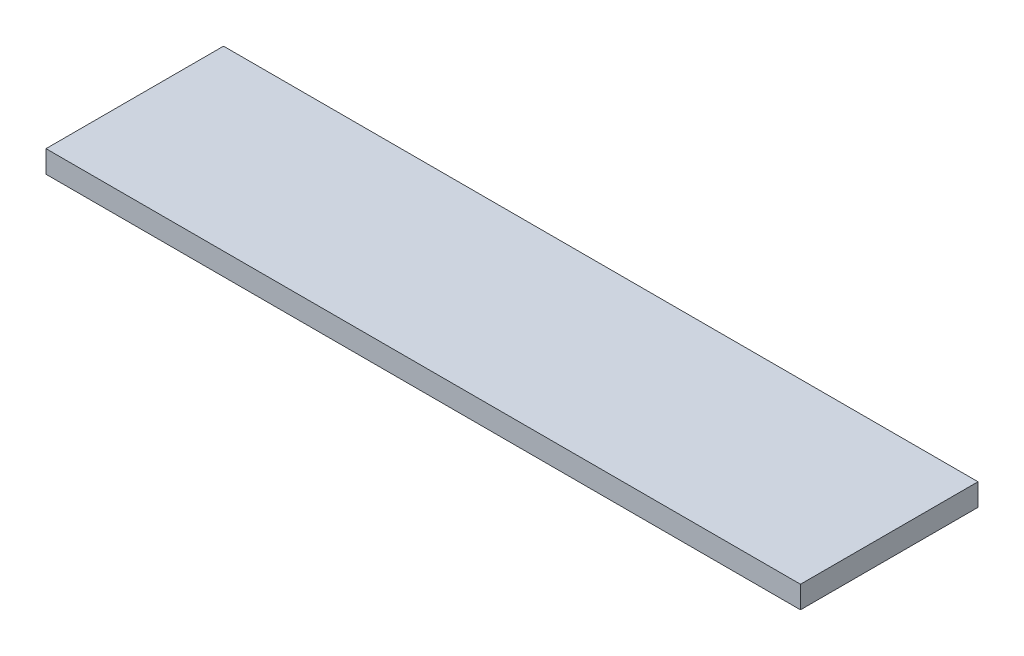
ISO-10303-21;
HEADER;
FILE_DESCRIPTION(('STEP AP214'),'2;1');
FILE_NAME('part.step','',(''),(''),'','','');
FILE_SCHEMA(('AUTOMOTIVE_DESIGN { 1 0 10303 214 1 1 1 1 }'));
ENDSEC;
DATA;
#1=APPLICATION_CONTEXT('core data for automotive mechanical design processes');
#2=APPLICATION_PROTOCOL_DEFINITION('international standard','automotive_design',2000,#1);
#3=PRODUCT_CONTEXT('',#1,'mechanical');
#4=PRODUCT('Part','Part','',(#3));
#5=PRODUCT_RELATED_PRODUCT_CATEGORY('part','',(#4));
#6=PRODUCT_DEFINITION_FORMATION('','',#4);
#7=PRODUCT_DEFINITION_CONTEXT('part definition',#1,'design');
#8=PRODUCT_DEFINITION('design','',#6,#7);
#9=PRODUCT_DEFINITION_SHAPE('','',#8);
#10=(LENGTH_UNIT() NAMED_UNIT(*) SI_UNIT(.MILLI.,.METRE.));
#11=(NAMED_UNIT(*) PLANE_ANGLE_UNIT() SI_UNIT($,.RADIAN.));
#12=(NAMED_UNIT(*) SI_UNIT($,.STERADIAN.) SOLID_ANGLE_UNIT());
#13=UNCERTAINTY_MEASURE_WITH_UNIT(LENGTH_MEASURE(1.E-05),#10,'distance_accuracy_value','');
#14=(GEOMETRIC_REPRESENTATION_CONTEXT(3) GLOBAL_UNCERTAINTY_ASSIGNED_CONTEXT((#13)) GLOBAL_UNIT_ASSIGNED_CONTEXT((#10,
#11,#12)) REPRESENTATION_CONTEXT('',''));
#15=CARTESIAN_POINT('',(0.,0.,0.));
#16=DIRECTION('',(0.,0.,1.));
#17=DIRECTION('',(1.,0.,0.));
#18=AXIS2_PLACEMENT_3D('',#15,#16,#17);
#19=CARTESIAN_POINT('',(85.,5.,-20.));
#20=DIRECTION('',(-1.,0.,0.));
#21=DIRECTION('',(0.,0.,1.));
#22=AXIS2_PLACEMENT_3D('',#19,#20,#21);
#23=PLANE('',#22);
#24=DIRECTION('',(0.,0.,-1.));
#25=VECTOR('',#24,1.);
#26=CARTESIAN_POINT('',(85.,0.,-20.));
#27=LINE('',#26,#25);
#28=CARTESIAN_POINT('',(85.,0.,20.));
#29=VERTEX_POINT('',#28);
#30=CARTESIAN_POINT('',(85.,0.,-20.));
#31=VERTEX_POINT('',#30);
#32=EDGE_CURVE('E103',#29,#31,#27,.T.);
#33=ORIENTED_EDGE('',*,*,#32,.T.);
#34=DIRECTION('',(0.,-1.,0.));
#35=VECTOR('',#34,1.);
#36=CARTESIAN_POINT('',(85.,5.,-20.));
#37=LINE('',#36,#35);
#38=CARTESIAN_POINT('',(85.,5.,-20.));
#39=VERTEX_POINT('',#38);
#40=EDGE_CURVE('E11',#39,#31,#37,.T.);
#41=ORIENTED_EDGE('',*,*,#40,.F.);
#42=DIRECTION('',(0.,0.,-1.));
#43=VECTOR('',#42,1.);
#44=CARTESIAN_POINT('',(85.,5.,-20.));
#45=LINE('',#44,#43);
#46=CARTESIAN_POINT('',(85.,5.,20.));
#47=VERTEX_POINT('',#46);
#48=EDGE_CURVE('E91',#47,#39,#45,.T.);
#49=ORIENTED_EDGE('',*,*,#48,.F.);
#50=DIRECTION('',(0.,-1.,0.));
#51=VECTOR('',#50,1.);
#52=CARTESIAN_POINT('',(85.,5.,20.));
#53=LINE('',#52,#51);
#54=EDGE_CURVE('E99',#47,#29,#53,.T.);
#55=ORIENTED_EDGE('',*,*,#54,.T.);
#56=EDGE_LOOP('',(#33,#41,#49,#55));
#57=FACE_BOUND('',#56,.T.);
#58=ADVANCED_FACE('F40',(#57),#23,.F.);
#59=CARTESIAN_POINT('',(-85.,5.,-20.));
#60=DIRECTION('',(0.,0.,1.));
#61=DIRECTION('',(1.,0.,0.));
#62=AXIS2_PLACEMENT_3D('',#59,#60,#61);
#63=PLANE('',#62);
#64=DIRECTION('',(-1.,0.,0.));
#65=VECTOR('',#64,1.);
#66=CARTESIAN_POINT('',(-85.,0.,-20.));
#67=LINE('',#66,#65);
#68=CARTESIAN_POINT('',(-85.,0.,-20.));
#69=VERTEX_POINT('',#68);
#70=EDGE_CURVE('E95',#31,#69,#67,.T.);
#71=ORIENTED_EDGE('',*,*,#70,.T.);
#72=DIRECTION('',(0.,-1.,0.));
#73=VECTOR('',#72,1.);
#74=CARTESIAN_POINT('',(-85.,5.,-20.));
#75=LINE('',#74,#73);
#76=CARTESIAN_POINT('',(-85.,5.,-20.));
#77=VERTEX_POINT('',#76);
#78=EDGE_CURVE('E48',#77,#69,#75,.T.);
#79=ORIENTED_EDGE('',*,*,#78,.F.);
#80=DIRECTION('',(-1.,0.,0.));
#81=VECTOR('',#80,1.);
#82=CARTESIAN_POINT('',(-85.,5.,-20.));
#83=LINE('',#82,#81);
#84=EDGE_CURVE('E86',#39,#77,#83,.T.);
#85=ORIENTED_EDGE('',*,*,#84,.F.);
#86=ORIENTED_EDGE('',*,*,#40,.T.);
#87=EDGE_LOOP('',(#71,#79,#85,#86));
#88=FACE_BOUND('',#87,.T.);
#89=ADVANCED_FACE('F94',(#88),#63,.F.);
#90=CARTESIAN_POINT('',(-85.,5.,-20.));
#91=DIRECTION('',(1.,0.,0.));
#92=DIRECTION('',(0.,0.,-1.));
#93=AXIS2_PLACEMENT_3D('',#90,#91,#92);
#94=PLANE('',#93);
#95=DIRECTION('',(0.,0.,1.));
#96=VECTOR('',#95,1.);
#97=CARTESIAN_POINT('',(-85.,0.,-20.));
#98=LINE('',#97,#96);
#99=CARTESIAN_POINT('',(-85.,0.,20.));
#100=VERTEX_POINT('',#99);
#101=EDGE_CURVE('E73',#69,#100,#98,.T.);
#102=ORIENTED_EDGE('',*,*,#101,.T.);
#103=DIRECTION('',(0.,-1.,0.));
#104=VECTOR('',#103,1.);
#105=CARTESIAN_POINT('',(-85.,5.,20.));
#106=LINE('',#105,#104);
#107=CARTESIAN_POINT('',(-85.,5.,20.));
#108=VERTEX_POINT('',#107);
#109=EDGE_CURVE('E96',#108,#100,#106,.T.);
#110=ORIENTED_EDGE('',*,*,#109,.F.);
#111=DIRECTION('',(0.,0.,1.));
#112=VECTOR('',#111,1.);
#113=CARTESIAN_POINT('',(-85.,5.,-20.));
#114=LINE('',#113,#112);
#115=EDGE_CURVE('E89',#77,#108,#114,.T.);
#116=ORIENTED_EDGE('',*,*,#115,.F.);
#117=ORIENTED_EDGE('',*,*,#78,.T.);
#118=EDGE_LOOP('',(#102,#110,#116,#117));
#119=FACE_BOUND('',#118,.T.);
#120=ADVANCED_FACE('F97',(#119),#94,.F.);
#121=CARTESIAN_POINT('',(-85.,5.,20.));
#122=DIRECTION('',(0.,0.,-1.));
#123=DIRECTION('',(-1.,0.,0.));
#124=AXIS2_PLACEMENT_3D('',#121,#122,#123);
#125=PLANE('',#124);
#126=DIRECTION('',(1.,0.,0.));
#127=VECTOR('',#126,1.);
#128=CARTESIAN_POINT('',(-85.,0.,20.));
#129=LINE('',#128,#127);
#130=EDGE_CURVE('E79',#100,#29,#129,.T.);
#131=ORIENTED_EDGE('',*,*,#130,.T.);
#132=ORIENTED_EDGE('',*,*,#54,.F.);
#133=DIRECTION('',(1.,0.,0.));
#134=VECTOR('',#133,1.);
#135=CARTESIAN_POINT('',(-85.,5.,20.));
#136=LINE('',#135,#134);
#137=EDGE_CURVE('E56',#108,#47,#136,.T.);
#138=ORIENTED_EDGE('',*,*,#137,.F.);
#139=ORIENTED_EDGE('',*,*,#109,.T.);
#140=EDGE_LOOP('',(#131,#132,#138,#139));
#141=FACE_BOUND('',#140,.T.);
#142=ADVANCED_FACE('F110',(#141),#125,.F.);
#143=CARTESIAN_POINT('',(0.,5.,0.));
#144=DIRECTION('',(0.,1.,0.));
#145=DIRECTION('',(0.,0.,1.));
#146=AXIS2_PLACEMENT_3D('',#143,#144,#145);
#147=PLANE('',#146);
#148=ORIENTED_EDGE('',*,*,#48,.T.);
#149=ORIENTED_EDGE('',*,*,#84,.T.);
#150=ORIENTED_EDGE('',*,*,#115,.T.);
#151=ORIENTED_EDGE('',*,*,#137,.T.);
#152=EDGE_LOOP('',(#148,#149,#150,#151));
#153=FACE_BOUND('',#152,.T.);
#154=ADVANCED_FACE('F87',(#153),#147,.T.);
#155=CARTESIAN_POINT('',(0.,0.,0.));
#156=DIRECTION('',(0.,1.,0.));
#157=DIRECTION('',(0.,0.,1.));
#158=AXIS2_PLACEMENT_3D('',#155,#156,#157);
#159=PLANE('',#158);
#160=ORIENTED_EDGE('',*,*,#32,.F.);
#161=ORIENTED_EDGE('',*,*,#130,.F.);
#162=ORIENTED_EDGE('',*,*,#101,.F.);
#163=ORIENTED_EDGE('',*,*,#70,.F.);
#164=EDGE_LOOP('',(#160,#161,#162,#163));
#165=FACE_BOUND('',#164,.T.);
#166=ADVANCED_FACE('F113',(#165),#159,.F.);
#167=CLOSED_SHELL('',(#58,#89,#120,#142,#154,#166));
#168=MANIFOLD_SOLID_BREP('B2',#167);
#169=ADVANCED_BREP_SHAPE_REPRESENTATION('',(#18,#168),#14);
#170=SHAPE_DEFINITION_REPRESENTATION(#9,#169);
ENDSEC;
END-ISO-10303-21;
